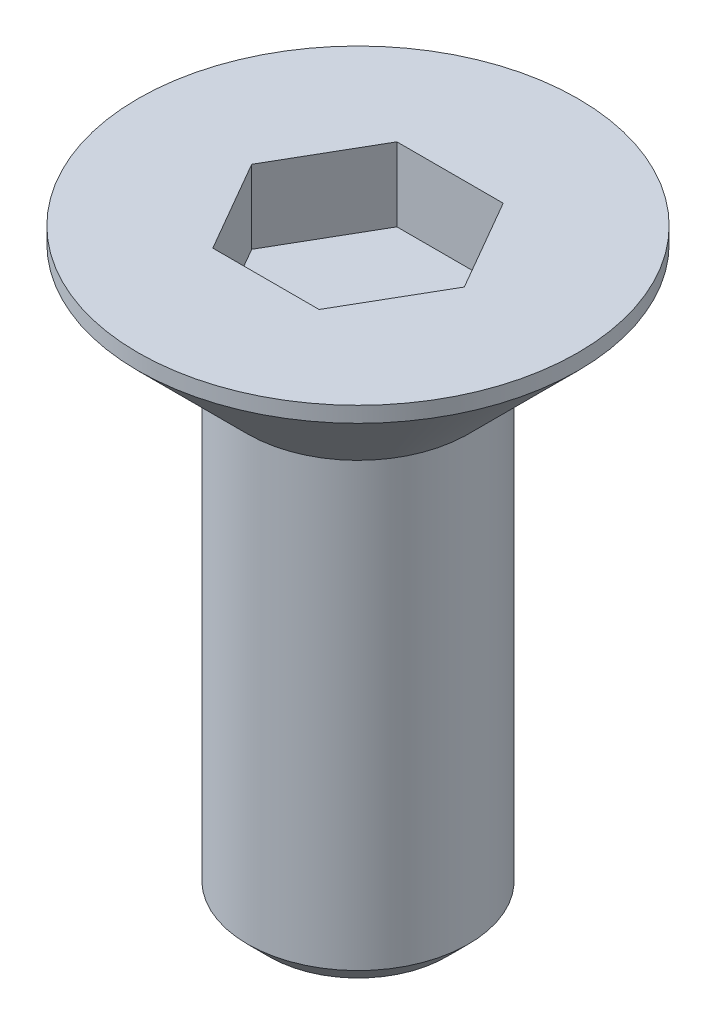
ISO-10303-21;
HEADER;
FILE_DESCRIPTION(('STEP AP214'),'2;1');
FILE_NAME('part.step','',(''),(''),'','','');
FILE_SCHEMA(('AUTOMOTIVE_DESIGN { 1 0 10303 214 1 1 1 1 }'));
ENDSEC;
DATA;
#1=APPLICATION_CONTEXT('core data for automotive mechanical design processes');
#2=APPLICATION_PROTOCOL_DEFINITION('international standard','automotive_design',2000,#1);
#3=PRODUCT_CONTEXT('',#1,'mechanical');
#4=PRODUCT('Part','Part','',(#3));
#5=PRODUCT_RELATED_PRODUCT_CATEGORY('part','',(#4));
#6=PRODUCT_DEFINITION_FORMATION('','',#4);
#7=PRODUCT_DEFINITION_CONTEXT('part definition',#1,'design');
#8=PRODUCT_DEFINITION('design','',#6,#7);
#9=PRODUCT_DEFINITION_SHAPE('','',#8);
#10=(LENGTH_UNIT() NAMED_UNIT(*) SI_UNIT(.MILLI.,.METRE.));
#11=(NAMED_UNIT(*) PLANE_ANGLE_UNIT() SI_UNIT($,.RADIAN.));
#12=(NAMED_UNIT(*) SI_UNIT($,.STERADIAN.) SOLID_ANGLE_UNIT());
#13=UNCERTAINTY_MEASURE_WITH_UNIT(LENGTH_MEASURE(1.E-05),#10,'distance_accuracy_value','');
#14=(GEOMETRIC_REPRESENTATION_CONTEXT(3) GLOBAL_UNCERTAINTY_ASSIGNED_CONTEXT((#13)) GLOBAL_UNIT_ASSIGNED_CONTEXT((#10,
#11,#12)) REPRESENTATION_CONTEXT('',''));
#15=CARTESIAN_POINT('',(0.,0.,0.));
#16=DIRECTION('',(0.,0.,1.));
#17=DIRECTION('',(1.,0.,0.));
#18=AXIS2_PLACEMENT_3D('',#15,#16,#17);
#19=CARTESIAN_POINT('',(0.,0.,0.));
#20=DIRECTION('',(0.,-1.,0.));
#21=DIRECTION('',(0.,0.,-1.));
#22=AXIS2_PLACEMENT_3D('',#19,#20,#21);
#23=PLANE('',#22);
#24=DIRECTION('',(-0.5,0.,0.866025403784439));
#25=VECTOR('',#24,1.);
#26=CARTESIAN_POINT('',(-0.721687836487032,0.,-1.25));
#27=LINE('',#26,#25);
#28=CARTESIAN_POINT('',(-0.721687836487032,0.,-1.25));
#29=VERTEX_POINT('',#28);
#30=CARTESIAN_POINT('',(-1.44337567297406,0.,0.));
#31=VERTEX_POINT('',#30);
#32=EDGE_CURVE('E124',#29,#31,#27,.T.);
#33=ORIENTED_EDGE('',*,*,#32,.F.);
#34=DIRECTION('',(-1.,0.,0.));
#35=VECTOR('',#34,1.);
#36=CARTESIAN_POINT('',(0.721687836487033,0.,-1.25));
#37=LINE('',#36,#35);
#38=CARTESIAN_POINT('',(0.721687836487033,0.,-1.25));
#39=VERTEX_POINT('',#38);
#40=EDGE_CURVE('E50',#39,#29,#37,.T.);
#41=ORIENTED_EDGE('',*,*,#40,.F.);
#42=DIRECTION('',(-0.5,0.,-0.866025403784439));
#43=VECTOR('',#42,1.);
#44=CARTESIAN_POINT('',(1.44337567297406,0.,0.));
#45=LINE('',#44,#43);
#46=CARTESIAN_POINT('',(1.44337567297406,0.,0.));
#47=VERTEX_POINT('',#46);
#48=EDGE_CURVE('E133',#47,#39,#45,.T.);
#49=ORIENTED_EDGE('',*,*,#48,.F.);
#50=DIRECTION('',(0.5,0.,-0.866025403784438));
#51=VECTOR('',#50,1.);
#52=CARTESIAN_POINT('',(0.721687836487032,0.,1.25));
#53=LINE('',#52,#51);
#54=CARTESIAN_POINT('',(0.721687836487032,0.,1.25));
#55=VERTEX_POINT('',#54);
#56=EDGE_CURVE('E131',#55,#47,#53,.T.);
#57=ORIENTED_EDGE('',*,*,#56,.F.);
#58=DIRECTION('',(1.,0.,0.));
#59=VECTOR('',#58,1.);
#60=CARTESIAN_POINT('',(-0.721687836487033,0.,1.25));
#61=LINE('',#60,#59);
#62=CARTESIAN_POINT('',(-0.721687836487033,0.,1.25));
#63=VERTEX_POINT('',#62);
#64=EDGE_CURVE('E98',#63,#55,#61,.T.);
#65=ORIENTED_EDGE('',*,*,#64,.F.);
#66=DIRECTION('',(0.5,0.,0.866025403784439));
#67=VECTOR('',#66,1.);
#68=CARTESIAN_POINT('',(-1.44337567297406,0.,0.));
#69=LINE('',#68,#67);
#70=EDGE_CURVE('E127',#31,#63,#69,.T.);
#71=ORIENTED_EDGE('',*,*,#70,.F.);
#72=EDGE_LOOP('',(#33,#41,#49,#57,#65,#71));
#73=FACE_BOUND('',#72,.T.);
#74=CARTESIAN_POINT('',(0.,0.,0.));
#75=DIRECTION('',(0.,-1.,0.));
#76=DIRECTION('',(0.,0.,-1.));
#77=AXIS2_PLACEMENT_3D('',#74,#75,#76);
#78=CIRCLE('',#77,2.98786796564402);
#79=CARTESIAN_POINT('',(0.,0.,-2.98786796564402));
#80=VERTEX_POINT('',#79);
#81=EDGE_CURVE('E145',#80,#80,#78,.F.);
#82=ORIENTED_EDGE('',*,*,#81,.T.);
#83=EDGE_LOOP('',(#82));
#84=FACE_BOUND('',#83,.T.);
#85=ADVANCED_FACE('F35',(#73,#84),#23,.F.);
#86=CARTESIAN_POINT('',(0.,-1.7,0.));
#87=DIRECTION('',(0.,1.,0.));
#88=DIRECTION('',(0.,0.,1.));
#89=AXIS2_PLACEMENT_3D('',#86,#87,#88);
#90=CONICAL_SURFACE('',#89,1.5,0.785398163397443);
#91=CARTESIAN_POINT('',(0.,-0.212132034355965,0.));
#92=DIRECTION('',(0.,-1.,0.));
#93=DIRECTION('',(0.,0.,-1.));
#94=AXIS2_PLACEMENT_3D('',#91,#92,#93);
#95=CIRCLE('',#94,2.98786796564402);
#96=CARTESIAN_POINT('',(0.,-0.212132034355965,-2.98786796564402));
#97=VERTEX_POINT('',#96);
#98=EDGE_CURVE('E148',#97,#97,#95,.T.);
#99=ORIENTED_EDGE('',*,*,#98,.T.);
#100=EDGE_LOOP('',(#99));
#101=FACE_BOUND('',#100,.T.);
#102=CARTESIAN_POINT('',(0.,-1.7,0.));
#103=DIRECTION('',(0.,1.,0.));
#104=DIRECTION('',(0.,0.,1.));
#105=AXIS2_PLACEMENT_3D('',#102,#103,#104);
#106=CIRCLE('',#105,1.5);
#107=CARTESIAN_POINT('',(0.,-1.7,1.5));
#108=VERTEX_POINT('',#107);
#109=EDGE_CURVE('E137',#108,#108,#106,.T.);
#110=ORIENTED_EDGE('',*,*,#109,.T.);
#111=EDGE_LOOP('',(#110));
#112=FACE_BOUND('',#111,.T.);
#113=ADVANCED_FACE('F170',(#101,#112),#90,.T.);
#114=CARTESIAN_POINT('',(0.,0.,0.));
#115=DIRECTION('',(0.,1.,0.));
#116=DIRECTION('',(0.,0.,1.));
#117=AXIS2_PLACEMENT_3D('',#114,#115,#116);
#118=CYLINDRICAL_SURFACE('',#117,1.5);
#119=CARTESIAN_POINT('',(0.,-7.7,0.));
#120=DIRECTION('',(0.,1.,0.));
#121=DIRECTION('',(0.,0.,1.));
#122=AXIS2_PLACEMENT_3D('',#119,#120,#121);
#123=CIRCLE('',#122,1.5);
#124=CARTESIAN_POINT('',(0.,-7.7,1.5));
#125=VERTEX_POINT('',#124);
#126=EDGE_CURVE('E43',#125,#125,#123,.T.);
#127=ORIENTED_EDGE('',*,*,#126,.T.);
#128=EDGE_LOOP('',(#127));
#129=FACE_BOUND('',#128,.T.);
#130=ORIENTED_EDGE('',*,*,#109,.F.);
#131=EDGE_LOOP('',(#130));
#132=FACE_BOUND('',#131,.T.);
#133=ADVANCED_FACE('F153',(#129,#132),#118,.T.);
#134=CARTESIAN_POINT('',(1.5,-8.,0.));
#135=DIRECTION('',(0.,1.,0.));
#136=DIRECTION('',(0.,0.,1.));
#137=AXIS2_PLACEMENT_3D('',#134,#135,#136);
#138=PLANE('',#137);
#139=CARTESIAN_POINT('',(0.,-8.,0.));
#140=DIRECTION('',(0.,1.,0.));
#141=DIRECTION('',(0.,0.,1.));
#142=AXIS2_PLACEMENT_3D('',#139,#140,#141);
#143=CIRCLE('',#142,1.2);
#144=CARTESIAN_POINT('',(0.,-8.,1.2));
#145=VERTEX_POINT('',#144);
#146=EDGE_CURVE('E11',#145,#145,#143,.F.);
#147=ORIENTED_EDGE('',*,*,#146,.T.);
#148=EDGE_LOOP('',(#147));
#149=FACE_BOUND('',#148,.T.);
#150=ADVANCED_FACE('F166',(#149),#138,.F.);
#151=CARTESIAN_POINT('',(0.,0.,0.));
#152=DIRECTION('',(0.,-1.,0.));
#153=DIRECTION('',(0.,0.,-1.));
#154=AXIS2_PLACEMENT_3D('',#151,#152,#153);
#155=CYLINDRICAL_SURFACE('',#154,2.98786796564402);
#156=ORIENTED_EDGE('',*,*,#98,.F.);
#157=EDGE_LOOP('',(#156));
#158=FACE_BOUND('',#157,.T.);
#159=ORIENTED_EDGE('',*,*,#81,.F.);
#160=EDGE_LOOP('',(#159));
#161=FACE_BOUND('',#160,.T.);
#162=ADVANCED_FACE('F158',(#158,#161),#155,.T.);
#163=CARTESIAN_POINT('',(0.,-7.7,0.));
#164=DIRECTION('',(0.,1.,0.));
#165=DIRECTION('',(0.,0.,1.));
#166=AXIS2_PLACEMENT_3D('',#163,#164,#165);
#167=CONICAL_SURFACE('',#166,1.5,0.785398163397455);
#168=ORIENTED_EDGE('',*,*,#146,.F.);
#169=EDGE_LOOP('',(#168));
#170=FACE_BOUND('',#169,.T.);
#171=ORIENTED_EDGE('',*,*,#126,.F.);
#172=EDGE_LOOP('',(#171));
#173=FACE_BOUND('',#172,.T.);
#174=ADVANCED_FACE('F37',(#170,#173),#167,.T.);
#175=CARTESIAN_POINT('',(0.721687836487033,-1.,-1.25));
#176=DIRECTION('',(0.,0.,-1.));
#177=DIRECTION('',(-1.,0.,0.));
#178=AXIS2_PLACEMENT_3D('',#175,#176,#177);
#179=PLANE('',#178);
#180=ORIENTED_EDGE('',*,*,#40,.T.);
#181=DIRECTION('',(0.,1.,0.));
#182=VECTOR('',#181,1.);
#183=CARTESIAN_POINT('',(-0.721687836487032,-1.,-1.25));
#184=LINE('',#183,#182);
#185=CARTESIAN_POINT('',(-0.721687836487032,-1.,-1.25));
#186=VERTEX_POINT('',#185);
#187=EDGE_CURVE('E80',#186,#29,#184,.T.);
#188=ORIENTED_EDGE('',*,*,#187,.F.);
#189=DIRECTION('',(-1.,0.,0.));
#190=VECTOR('',#189,1.);
#191=CARTESIAN_POINT('',(0.721687836487033,-1.,-1.25));
#192=LINE('',#191,#190);
#193=CARTESIAN_POINT('',(0.721687836487033,-1.,-1.25));
#194=VERTEX_POINT('',#193);
#195=EDGE_CURVE('E135',#194,#186,#192,.T.);
#196=ORIENTED_EDGE('',*,*,#195,.F.);
#197=DIRECTION('',(0.,1.,0.));
#198=VECTOR('',#197,1.);
#199=CARTESIAN_POINT('',(0.721687836487033,-1.,-1.25));
#200=LINE('',#199,#198);
#201=EDGE_CURVE('E58',#194,#39,#200,.T.);
#202=ORIENTED_EDGE('',*,*,#201,.T.);
#203=EDGE_LOOP('',(#180,#188,#196,#202));
#204=FACE_BOUND('',#203,.T.);
#205=ADVANCED_FACE('F157',(#204),#179,.F.);
#206=CARTESIAN_POINT('',(1.44337567297406,-1.,0.));
#207=DIRECTION('',(0.866025403784439,0.,-0.5));
#208=DIRECTION('',(-0.5,0.,-0.866025403784439));
#209=AXIS2_PLACEMENT_3D('',#206,#207,#208);
#210=PLANE('',#209);
#211=ORIENTED_EDGE('',*,*,#48,.T.);
#212=ORIENTED_EDGE('',*,*,#201,.F.);
#213=DIRECTION('',(-0.5,0.,-0.866025403784439));
#214=VECTOR('',#213,1.);
#215=CARTESIAN_POINT('',(1.44337567297406,-1.,0.));
#216=LINE('',#215,#214);
#217=CARTESIAN_POINT('',(1.44337567297406,-1.,0.));
#218=VERTEX_POINT('',#217);
#219=EDGE_CURVE('E110',#218,#194,#216,.T.);
#220=ORIENTED_EDGE('',*,*,#219,.F.);
#221=DIRECTION('',(0.,1.,0.));
#222=VECTOR('',#221,1.);
#223=CARTESIAN_POINT('',(1.44337567297406,-1.,0.));
#224=LINE('',#223,#222);
#225=EDGE_CURVE('E102',#218,#47,#224,.T.);
#226=ORIENTED_EDGE('',*,*,#225,.T.);
#227=EDGE_LOOP('',(#211,#212,#220,#226));
#228=FACE_BOUND('',#227,.T.);
#229=ADVANCED_FACE('F164',(#228),#210,.F.);
#230=CARTESIAN_POINT('',(0.721687836487032,-1.,1.25));
#231=DIRECTION('',(0.866025403784439,0.,0.5));
#232=DIRECTION('',(0.5,0.,-0.866025403784438));
#233=AXIS2_PLACEMENT_3D('',#230,#231,#232);
#234=PLANE('',#233);
#235=ORIENTED_EDGE('',*,*,#56,.T.);
#236=ORIENTED_EDGE('',*,*,#225,.F.);
#237=DIRECTION('',(0.5,0.,-0.866025403784438));
#238=VECTOR('',#237,1.);
#239=CARTESIAN_POINT('',(0.721687836487032,-1.,1.25));
#240=LINE('',#239,#238);
#241=CARTESIAN_POINT('',(0.721687836487032,-1.,1.25));
#242=VERTEX_POINT('',#241);
#243=EDGE_CURVE('E106',#242,#218,#240,.T.);
#244=ORIENTED_EDGE('',*,*,#243,.F.);
#245=DIRECTION('',(0.,1.,0.));
#246=VECTOR('',#245,1.);
#247=CARTESIAN_POINT('',(0.721687836487032,-1.,1.25));
#248=LINE('',#247,#246);
#249=EDGE_CURVE('E91',#242,#55,#248,.T.);
#250=ORIENTED_EDGE('',*,*,#249,.T.);
#251=EDGE_LOOP('',(#235,#236,#244,#250));
#252=FACE_BOUND('',#251,.T.);
#253=ADVANCED_FACE('F107',(#252),#234,.F.);
#254=CARTESIAN_POINT('',(-0.721687836487033,-1.,1.25));
#255=DIRECTION('',(0.,0.,1.));
#256=DIRECTION('',(1.,0.,0.));
#257=AXIS2_PLACEMENT_3D('',#254,#255,#256);
#258=PLANE('',#257);
#259=ORIENTED_EDGE('',*,*,#64,.T.);
#260=ORIENTED_EDGE('',*,*,#249,.F.);
#261=DIRECTION('',(1.,0.,0.));
#262=VECTOR('',#261,1.);
#263=CARTESIAN_POINT('',(-0.721687836487033,-1.,1.25));
#264=LINE('',#263,#262);
#265=CARTESIAN_POINT('',(-0.721687836487033,-1.,1.25));
#266=VERTEX_POINT('',#265);
#267=EDGE_CURVE('E95',#266,#242,#264,.T.);
#268=ORIENTED_EDGE('',*,*,#267,.F.);
#269=DIRECTION('',(0.,1.,0.));
#270=VECTOR('',#269,1.);
#271=CARTESIAN_POINT('',(-0.721687836487033,-1.,1.25));
#272=LINE('',#271,#270);
#273=EDGE_CURVE('E103',#266,#63,#272,.T.);
#274=ORIENTED_EDGE('',*,*,#273,.T.);
#275=EDGE_LOOP('',(#259,#260,#268,#274));
#276=FACE_BOUND('',#275,.T.);
#277=ADVANCED_FACE('F93',(#276),#258,.F.);
#278=CARTESIAN_POINT('',(-1.44337567297406,-1.,0.));
#279=DIRECTION('',(-0.866025403784439,0.,0.5));
#280=DIRECTION('',(0.5,0.,0.866025403784439));
#281=AXIS2_PLACEMENT_3D('',#278,#279,#280);
#282=PLANE('',#281);
#283=ORIENTED_EDGE('',*,*,#70,.T.);
#284=ORIENTED_EDGE('',*,*,#273,.F.);
#285=DIRECTION('',(0.5,0.,0.866025403784439));
#286=VECTOR('',#285,1.);
#287=CARTESIAN_POINT('',(-1.44337567297406,-1.,0.));
#288=LINE('',#287,#286);
#289=CARTESIAN_POINT('',(-1.44337567297406,-1.,0.));
#290=VERTEX_POINT('',#289);
#291=EDGE_CURVE('E116',#290,#266,#288,.T.);
#292=ORIENTED_EDGE('',*,*,#291,.F.);
#293=DIRECTION('',(0.,1.,0.));
#294=VECTOR('',#293,1.);
#295=CARTESIAN_POINT('',(-1.44337567297406,-1.,0.));
#296=LINE('',#295,#294);
#297=EDGE_CURVE('E140',#290,#31,#296,.T.);
#298=ORIENTED_EDGE('',*,*,#297,.T.);
#299=EDGE_LOOP('',(#283,#284,#292,#298));
#300=FACE_BOUND('',#299,.T.);
#301=ADVANCED_FACE('F189',(#300),#282,.F.);
#302=CARTESIAN_POINT('',(-0.721687836487032,-1.,-1.25));
#303=DIRECTION('',(-0.866025403784439,0.,-0.5));
#304=DIRECTION('',(-0.5,0.,0.866025403784439));
#305=AXIS2_PLACEMENT_3D('',#302,#303,#304);
#306=PLANE('',#305);
#307=ORIENTED_EDGE('',*,*,#32,.T.);
#308=ORIENTED_EDGE('',*,*,#297,.F.);
#309=DIRECTION('',(-0.5,0.,0.866025403784439));
#310=VECTOR('',#309,1.);
#311=CARTESIAN_POINT('',(-0.721687836487032,-1.,-1.25));
#312=LINE('',#311,#310);
#313=EDGE_CURVE('E118',#186,#290,#312,.T.);
#314=ORIENTED_EDGE('',*,*,#313,.F.);
#315=ORIENTED_EDGE('',*,*,#187,.T.);
#316=EDGE_LOOP('',(#307,#308,#314,#315));
#317=FACE_BOUND('',#316,.T.);
#318=ADVANCED_FACE('F186',(#317),#306,.F.);
#319=CARTESIAN_POINT('',(-0.721687836487032,-1.,-1.25));
#320=DIRECTION('',(0.,1.,0.));
#321=DIRECTION('',(0.,0.,1.));
#322=AXIS2_PLACEMENT_3D('',#319,#320,#321);
#323=PLANE('',#322);
#324=ORIENTED_EDGE('',*,*,#195,.T.);
#325=ORIENTED_EDGE('',*,*,#313,.T.);
#326=ORIENTED_EDGE('',*,*,#291,.T.);
#327=ORIENTED_EDGE('',*,*,#267,.T.);
#328=ORIENTED_EDGE('',*,*,#243,.T.);
#329=ORIENTED_EDGE('',*,*,#219,.T.);
#330=EDGE_LOOP('',(#324,#325,#326,#327,#328,#329));
#331=FACE_BOUND('',#330,.T.);
#332=ADVANCED_FACE('F113',(#331),#323,.T.);
#333=CLOSED_SHELL('',(#85,#113,#133,#150,#162,#174,#205,#229,#253,#277,#301,#318,#332));
#334=MANIFOLD_SOLID_BREP('B2',#333);
#335=ADVANCED_BREP_SHAPE_REPRESENTATION('',(#18,#334),#14);
#336=SHAPE_DEFINITION_REPRESENTATION(#9,#335);
ENDSEC;
END-ISO-10303-21;
